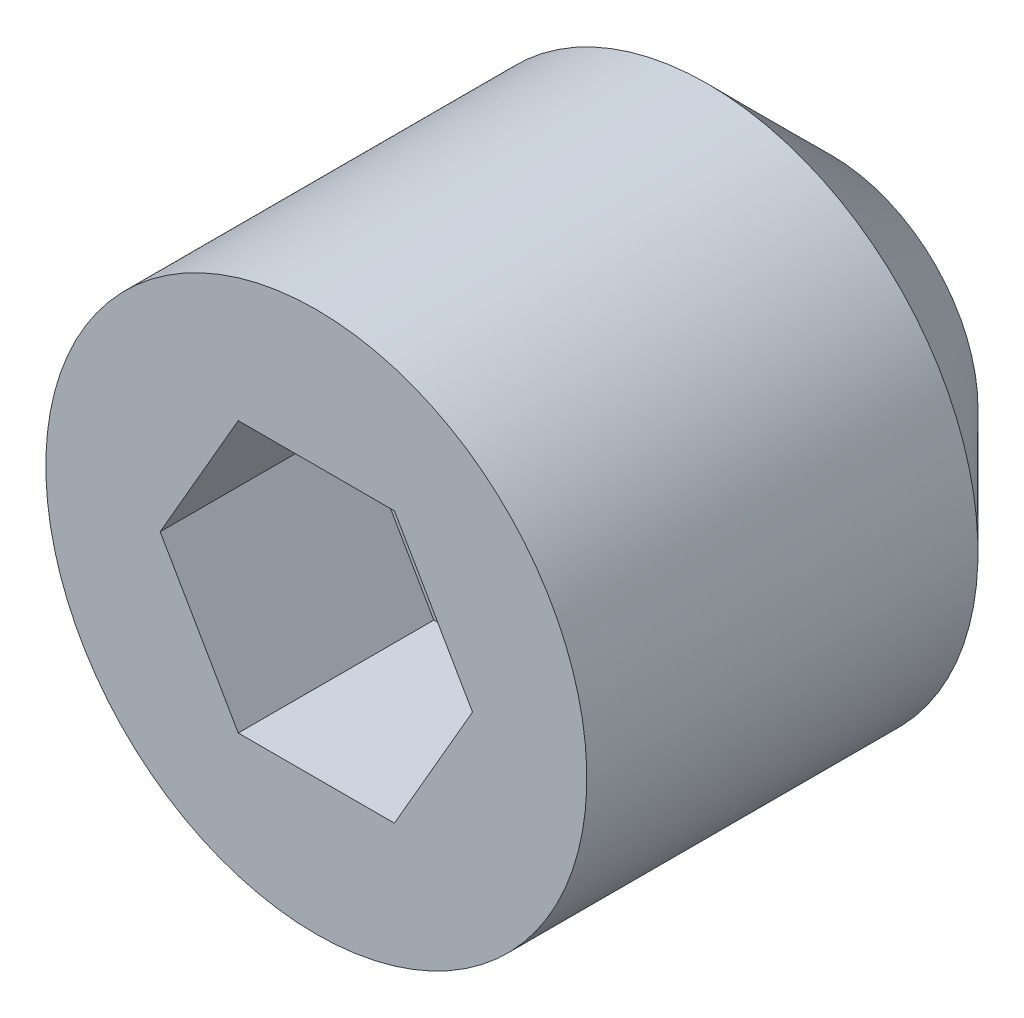
ISO-10303-21;
HEADER;
FILE_DESCRIPTION(('STEP AP214'),'2;1');
FILE_NAME('part.step','',(''),(''),'','','');
FILE_SCHEMA(('AUTOMOTIVE_DESIGN { 1 0 10303 214 1 1 1 1 }'));
ENDSEC;
DATA;
#1=APPLICATION_CONTEXT('core data for automotive mechanical design processes');
#2=APPLICATION_PROTOCOL_DEFINITION('international standard','automotive_design',2000,#1);
#3=PRODUCT_CONTEXT('',#1,'mechanical');
#4=PRODUCT('Part','Part','',(#3));
#5=PRODUCT_RELATED_PRODUCT_CATEGORY('part','',(#4));
#6=PRODUCT_DEFINITION_FORMATION('','',#4);
#7=PRODUCT_DEFINITION_CONTEXT('part definition',#1,'design');
#8=PRODUCT_DEFINITION('design','',#6,#7);
#9=PRODUCT_DEFINITION_SHAPE('','',#8);
#10=(LENGTH_UNIT() NAMED_UNIT(*) SI_UNIT(.MILLI.,.METRE.));
#11=(NAMED_UNIT(*) PLANE_ANGLE_UNIT() SI_UNIT($,.RADIAN.));
#12=(NAMED_UNIT(*) SI_UNIT($,.STERADIAN.) SOLID_ANGLE_UNIT());
#13=UNCERTAINTY_MEASURE_WITH_UNIT(LENGTH_MEASURE(1.E-05),#10,'distance_accuracy_value','');
#14=(GEOMETRIC_REPRESENTATION_CONTEXT(3) GLOBAL_UNCERTAINTY_ASSIGNED_CONTEXT((#13)) GLOBAL_UNIT_ASSIGNED_CONTEXT((#10,
#11,#12)) REPRESENTATION_CONTEXT('',''));
#15=CARTESIAN_POINT('',(0.,0.,0.));
#16=DIRECTION('',(0.,0.,1.));
#17=DIRECTION('',(1.,0.,0.));
#18=AXIS2_PLACEMENT_3D('',#15,#16,#17);
#19=CARTESIAN_POINT('',(22.6,0.,30.915));
#20=DIRECTION('',(0.,0.,1.));
#21=DIRECTION('',(1.,0.,0.));
#22=AXIS2_PLACEMENT_3D('',#19,#20,#21);
#23=PLANE('',#22);
#24=DIRECTION('',(0.5,0.866025403784438,0.));
#25=VECTOR('',#24,1.);
#26=CARTESIAN_POINT('',(24.7650635094611,-1.25,30.915));
#27=LINE('',#26,#25);
#28=CARTESIAN_POINT('',(24.0433756729741,-2.5,30.915));
#29=VERTEX_POINT('',#28);
#30=CARTESIAN_POINT('',(25.4867513459481,0.,30.915));
#31=VERTEX_POINT('',#30);
#32=EDGE_CURVE('E127',#29,#31,#27,.T.);
#33=ORIENTED_EDGE('',*,*,#32,.T.);
#34=DIRECTION('',(-0.5,0.866025403784439,0.));
#35=VECTOR('',#34,1.);
#36=CARTESIAN_POINT('',(24.7650635094611,1.25,30.915));
#37=LINE('',#36,#35);
#38=CARTESIAN_POINT('',(24.0433756729741,2.5,30.915));
#39=VERTEX_POINT('',#38);
#40=EDGE_CURVE('E67',#31,#39,#37,.T.);
#41=ORIENTED_EDGE('',*,*,#40,.T.);
#42=DIRECTION('',(1.,0.,0.));
#43=VECTOR('',#42,1.);
#44=CARTESIAN_POINT('',(23.321687836487,2.5,30.915));
#45=LINE('',#44,#43);
#46=CARTESIAN_POINT('',(21.1566243270259,2.5,30.915));
#47=VERTEX_POINT('',#46);
#48=EDGE_CURVE('E131',#39,#47,#45,.F.);
#49=ORIENTED_EDGE('',*,*,#48,.T.);
#50=DIRECTION('',(-0.5,-0.866025403784439,0.));
#51=VECTOR('',#50,1.);
#52=CARTESIAN_POINT('',(20.4349364905389,1.25,30.915));
#53=LINE('',#52,#51);
#54=CARTESIAN_POINT('',(19.7132486540519,0.,30.915));
#55=VERTEX_POINT('',#54);
#56=EDGE_CURVE('E139',#47,#55,#53,.T.);
#57=ORIENTED_EDGE('',*,*,#56,.T.);
#58=DIRECTION('',(0.5,-0.866025403784439,0.));
#59=VECTOR('',#58,1.);
#60=CARTESIAN_POINT('',(20.4349364905389,-1.25,30.915));
#61=LINE('',#60,#59);
#62=CARTESIAN_POINT('',(21.1566243270259,-2.5,30.915));
#63=VERTEX_POINT('',#62);
#64=EDGE_CURVE('E149',#55,#63,#61,.T.);
#65=ORIENTED_EDGE('',*,*,#64,.T.);
#66=DIRECTION('',(1.,0.,0.));
#67=VECTOR('',#66,1.);
#68=CARTESIAN_POINT('',(22.6,-2.5,30.915));
#69=LINE('',#68,#67);
#70=EDGE_CURVE('E153',#63,#29,#69,.T.);
#71=ORIENTED_EDGE('',*,*,#70,.T.);
#72=EDGE_LOOP('',(#33,#41,#49,#57,#65,#71));
#73=FACE_BOUND('',#72,.T.);
#74=ADVANCED_FACE('F16',(#73),#23,.T.);
#75=CARTESIAN_POINT('',(22.6000000000681,0.,26.5588457268109));
#76=DIRECTION('',(0.,0.,-1.));
#77=DIRECTION('',(0.,1.,0.));
#78=AXIS2_PLACEMENT_3D('',#75,#76,#77);
#79=CONICAL_SURFACE('',#78,0.,1.04719755119796);
#80=CARTESIAN_POINT('',(22.6,0.,24.9999999999204));
#81=DIRECTION('',(0.,0.,1.));
#82=DIRECTION('',(1.,0.,0.));
#83=AXIS2_PLACEMENT_3D('',#80,#81,#82);
#84=CIRCLE('',#83,2.6999999999588);
#85=CARTESIAN_POINT('',(25.2999999999588,0.,24.9999999999204));
#86=VERTEX_POINT('',#85);
#87=EDGE_CURVE('E135',#86,#86,#84,.T.);
#88=ORIENTED_EDGE('',*,*,#87,.F.);
#89=EDGE_LOOP('',(#88));
#90=FACE_BOUND('',#89,.T.);
#91=CARTESIAN_POINT('',(22.5999999999544,0.,26.5588457268393));
#92=VERTEX_POINT('',#91);
#93=VERTEX_LOOP('',#92);
#94=FACE_BOUND('',#93,.T.);
#95=ADVANCED_FACE('F71',(#90,#94),#79,.F.);
#96=CARTESIAN_POINT('',(23.321687836487,2.5,30.915));
#97=DIRECTION('',(0.,1.,0.));
#98=DIRECTION('',(0.,0.,1.));
#99=AXIS2_PLACEMENT_3D('',#96,#97,#98);
#100=PLANE('',#99);
#101=DIRECTION('',(0.,0.,1.));
#102=VECTOR('',#101,1.);
#103=CARTESIAN_POINT('',(21.1566243270259,2.5,30.915));
#104=LINE('',#103,#102);
#105=CARTESIAN_POINT('',(21.1566243270259,2.5,34.53));
#106=VERTEX_POINT('',#105);
#107=EDGE_CURVE('E141',#106,#47,#104,.F.);
#108=ORIENTED_EDGE('',*,*,#107,.T.);
#109=ORIENTED_EDGE('',*,*,#48,.F.);
#110=DIRECTION('',(0.,0.,1.));
#111=VECTOR('',#110,1.);
#112=CARTESIAN_POINT('',(24.0433756729741,2.5,30.915));
#113=LINE('',#112,#111);
#114=CARTESIAN_POINT('',(24.0433756729741,2.5,34.53));
#115=VERTEX_POINT('',#114);
#116=EDGE_CURVE('E122',#39,#115,#113,.T.);
#117=ORIENTED_EDGE('',*,*,#116,.T.);
#118=DIRECTION('',(1.,0.,0.));
#119=VECTOR('',#118,1.);
#120=CARTESIAN_POINT('',(25.1,2.5,34.53));
#121=LINE('',#120,#119);
#122=EDGE_CURVE('E137',#106,#115,#121,.T.);
#123=ORIENTED_EDGE('',*,*,#122,.F.);
#124=EDGE_LOOP('',(#108,#109,#117,#123));
#125=FACE_BOUND('',#124,.T.);
#126=ADVANCED_FACE('F73',(#125),#100,.F.);
#127=CARTESIAN_POINT('',(24.7650635094611,1.25,30.915));
#128=DIRECTION('',(0.866025403784439,0.5,0.));
#129=DIRECTION('',(-0.5,0.866025403784439,0.));
#130=AXIS2_PLACEMENT_3D('',#127,#128,#129);
#131=PLANE('',#130);
#132=ORIENTED_EDGE('',*,*,#116,.F.);
#133=ORIENTED_EDGE('',*,*,#40,.F.);
#134=DIRECTION('',(0.,0.,1.));
#135=VECTOR('',#134,1.);
#136=CARTESIAN_POINT('',(25.4867513459481,0.,30.915));
#137=LINE('',#136,#135);
#138=CARTESIAN_POINT('',(25.4867513459481,0.,34.53));
#139=VERTEX_POINT('',#138);
#140=EDGE_CURVE('E129',#31,#139,#137,.T.);
#141=ORIENTED_EDGE('',*,*,#140,.T.);
#142=DIRECTION('',(0.5,-0.866025403784438,0.));
#143=VECTOR('',#142,1.);
#144=CARTESIAN_POINT('',(24.0433756729741,2.5,34.53));
#145=LINE('',#144,#143);
#146=EDGE_CURVE('E125',#115,#139,#145,.T.);
#147=ORIENTED_EDGE('',*,*,#146,.F.);
#148=EDGE_LOOP('',(#132,#133,#141,#147));
#149=FACE_BOUND('',#148,.T.);
#150=ADVANCED_FACE('F80',(#149),#131,.F.);
#151=CARTESIAN_POINT('',(24.7650635094611,-1.25,30.915));
#152=DIRECTION('',(0.866025403784438,-0.5,0.));
#153=DIRECTION('',(0.5,0.866025403784438,0.));
#154=AXIS2_PLACEMENT_3D('',#151,#152,#153);
#155=PLANE('',#154);
#156=ORIENTED_EDGE('',*,*,#140,.F.);
#157=ORIENTED_EDGE('',*,*,#32,.F.);
#158=DIRECTION('',(0.,0.,1.));
#159=VECTOR('',#158,1.);
#160=CARTESIAN_POINT('',(24.0433756729741,-2.5,30.915));
#161=LINE('',#160,#159);
#162=CARTESIAN_POINT('',(24.0433756729741,-2.5,34.53));
#163=VERTEX_POINT('',#162);
#164=EDGE_CURVE('E151',#29,#163,#161,.T.);
#165=ORIENTED_EDGE('',*,*,#164,.T.);
#166=DIRECTION('',(-0.500000000000001,-0.866025403784438,0.));
#167=VECTOR('',#166,1.);
#168=CARTESIAN_POINT('',(25.4867513459481,0.,34.53));
#169=LINE('',#168,#167);
#170=EDGE_CURVE('E157',#139,#163,#169,.T.);
#171=ORIENTED_EDGE('',*,*,#170,.F.);
#172=EDGE_LOOP('',(#156,#157,#165,#171));
#173=FACE_BOUND('',#172,.T.);
#174=ADVANCED_FACE('F111',(#173),#155,.F.);
#175=CARTESIAN_POINT('',(22.6,-2.5,30.915));
#176=DIRECTION('',(0.,-1.,0.));
#177=DIRECTION('',(1.,0.,0.));
#178=AXIS2_PLACEMENT_3D('',#175,#176,#177);
#179=PLANE('',#178);
#180=ORIENTED_EDGE('',*,*,#164,.F.);
#181=ORIENTED_EDGE('',*,*,#70,.F.);
#182=DIRECTION('',(0.,0.,1.));
#183=VECTOR('',#182,1.);
#184=CARTESIAN_POINT('',(21.1566243270259,-2.5,30.915));
#185=LINE('',#184,#183);
#186=CARTESIAN_POINT('',(21.1566243270259,-2.5,34.53));
#187=VERTEX_POINT('',#186);
#188=EDGE_CURVE('E147',#63,#187,#185,.T.);
#189=ORIENTED_EDGE('',*,*,#188,.T.);
#190=DIRECTION('',(1.,0.,0.));
#191=VECTOR('',#190,1.);
#192=CARTESIAN_POINT('',(25.1,-2.5,34.53));
#193=LINE('',#192,#191);
#194=EDGE_CURVE('E162',#163,#187,#193,.F.);
#195=ORIENTED_EDGE('',*,*,#194,.F.);
#196=EDGE_LOOP('',(#180,#181,#189,#195));
#197=FACE_BOUND('',#196,.T.);
#198=ADVANCED_FACE('F108',(#197),#179,.F.);
#199=CARTESIAN_POINT('',(20.4349364905389,-1.25,30.915));
#200=DIRECTION('',(-0.866025403784439,-0.5,0.));
#201=DIRECTION('',(0.5,-0.866025403784439,0.));
#202=AXIS2_PLACEMENT_3D('',#199,#200,#201);
#203=PLANE('',#202);
#204=ORIENTED_EDGE('',*,*,#188,.F.);
#205=ORIENTED_EDGE('',*,*,#64,.F.);
#206=DIRECTION('',(0.,0.,1.));
#207=VECTOR('',#206,1.);
#208=CARTESIAN_POINT('',(19.7132486540519,0.,30.915));
#209=LINE('',#208,#207);
#210=CARTESIAN_POINT('',(19.7132486540519,0.,34.53));
#211=VERTEX_POINT('',#210);
#212=EDGE_CURVE('E32',#55,#211,#209,.T.);
#213=ORIENTED_EDGE('',*,*,#212,.T.);
#214=DIRECTION('',(-0.5,0.866025403784438,0.));
#215=VECTOR('',#214,1.);
#216=CARTESIAN_POINT('',(21.1566243270259,-2.5,34.53));
#217=LINE('',#216,#215);
#218=EDGE_CURVE('E169',#187,#211,#217,.T.);
#219=ORIENTED_EDGE('',*,*,#218,.F.);
#220=EDGE_LOOP('',(#204,#205,#213,#219));
#221=FACE_BOUND('',#220,.T.);
#222=ADVANCED_FACE('F104',(#221),#203,.F.);
#223=CARTESIAN_POINT('',(20.4349364905389,1.25,30.915));
#224=DIRECTION('',(-0.866025403784439,0.5,0.));
#225=DIRECTION('',(-0.5,-0.866025403784439,0.));
#226=AXIS2_PLACEMENT_3D('',#223,#224,#225);
#227=PLANE('',#226);
#228=ORIENTED_EDGE('',*,*,#212,.F.);
#229=ORIENTED_EDGE('',*,*,#56,.F.);
#230=ORIENTED_EDGE('',*,*,#107,.F.);
#231=DIRECTION('',(0.5,0.866025403784438,0.));
#232=VECTOR('',#231,1.);
#233=CARTESIAN_POINT('',(19.7132486540519,0.,34.53));
#234=LINE('',#233,#232);
#235=EDGE_CURVE('E171',#211,#106,#234,.T.);
#236=ORIENTED_EDGE('',*,*,#235,.F.);
#237=EDGE_LOOP('',(#228,#229,#230,#236));
#238=FACE_BOUND('',#237,.T.);
#239=ADVANCED_FACE('F100',(#238),#227,.F.);
#240=CARTESIAN_POINT('',(22.6,0.,27.2999999998547));
#241=DIRECTION('',(0.,0.,1.));
#242=DIRECTION('',(0.,-1.,0.));
#243=AXIS2_PLACEMENT_3D('',#240,#241,#242);
#244=CONICAL_SURFACE('',#243,4.99999999989304,0.785398163397448);
#245=ORIENTED_EDGE('',*,*,#87,.T.);
#246=EDGE_LOOP('',(#245));
#247=FACE_BOUND('',#246,.T.);
#248=CARTESIAN_POINT('',(22.6,0.,27.3));
#249=DIRECTION('',(0.,0.,1.));
#250=DIRECTION('',(0.,-1.,0.));
#251=AXIS2_PLACEMENT_3D('',#248,#249,#250);
#252=CIRCLE('',#251,5.);
#253=CARTESIAN_POINT('',(22.6,-5.,27.3));
#254=VERTEX_POINT('',#253);
#255=EDGE_CURVE('E24',#254,#254,#252,.T.);
#256=ORIENTED_EDGE('',*,*,#255,.F.);
#257=EDGE_LOOP('',(#256));
#258=FACE_BOUND('',#257,.T.);
#259=ADVANCED_FACE('F92',(#247,#258),#244,.T.);
#260=CARTESIAN_POINT('',(25.1,0.,34.53));
#261=DIRECTION('',(0.,0.,1.));
#262=DIRECTION('',(0.,-1.,0.));
#263=AXIS2_PLACEMENT_3D('',#260,#261,#262);
#264=PLANE('',#263);
#265=CARTESIAN_POINT('',(22.6,0.,34.53));
#266=DIRECTION('',(0.,0.,1.));
#267=DIRECTION('',(0.,-1.,0.));
#268=AXIS2_PLACEMENT_3D('',#265,#266,#267);
#269=CIRCLE('',#268,5.);
#270=CARTESIAN_POINT('',(22.6,-5.,34.53));
#271=VERTEX_POINT('',#270);
#272=EDGE_CURVE('E11',#271,#271,#269,.F.);
#273=ORIENTED_EDGE('',*,*,#272,.F.);
#274=EDGE_LOOP('',(#273));
#275=FACE_BOUND('',#274,.T.);
#276=ORIENTED_EDGE('',*,*,#218,.T.);
#277=ORIENTED_EDGE('',*,*,#235,.T.);
#278=ORIENTED_EDGE('',*,*,#122,.T.);
#279=ORIENTED_EDGE('',*,*,#146,.T.);
#280=ORIENTED_EDGE('',*,*,#170,.T.);
#281=ORIENTED_EDGE('',*,*,#194,.T.);
#282=EDGE_LOOP('',(#276,#277,#278,#279,#280,#281));
#283=FACE_BOUND('',#282,.T.);
#284=ADVANCED_FACE('F86',(#275,#283),#264,.T.);
#285=CARTESIAN_POINT('',(22.6,0.,30.915));
#286=DIRECTION('',(0.,0.,1.));
#287=DIRECTION('',(0.,-1.,0.));
#288=AXIS2_PLACEMENT_3D('',#285,#286,#287);
#289=CYLINDRICAL_SURFACE('',#288,5.);
#290=ORIENTED_EDGE('',*,*,#255,.T.);
#291=EDGE_LOOP('',(#290));
#292=FACE_BOUND('',#291,.T.);
#293=ORIENTED_EDGE('',*,*,#272,.T.);
#294=EDGE_LOOP('',(#293));
#295=FACE_BOUND('',#294,.T.);
#296=ADVANCED_FACE('F84',(#292,#295),#289,.T.);
#297=CLOSED_SHELL('',(#74,#95,#126,#150,#174,#198,#222,#239,#259,#284,#296));
#298=MANIFOLD_SOLID_BREP('B1',#297);
#299=ADVANCED_BREP_SHAPE_REPRESENTATION('',(#18,#298),#14);
#300=SHAPE_DEFINITION_REPRESENTATION(#9,#299);
ENDSEC;
END-ISO-10303-21;
